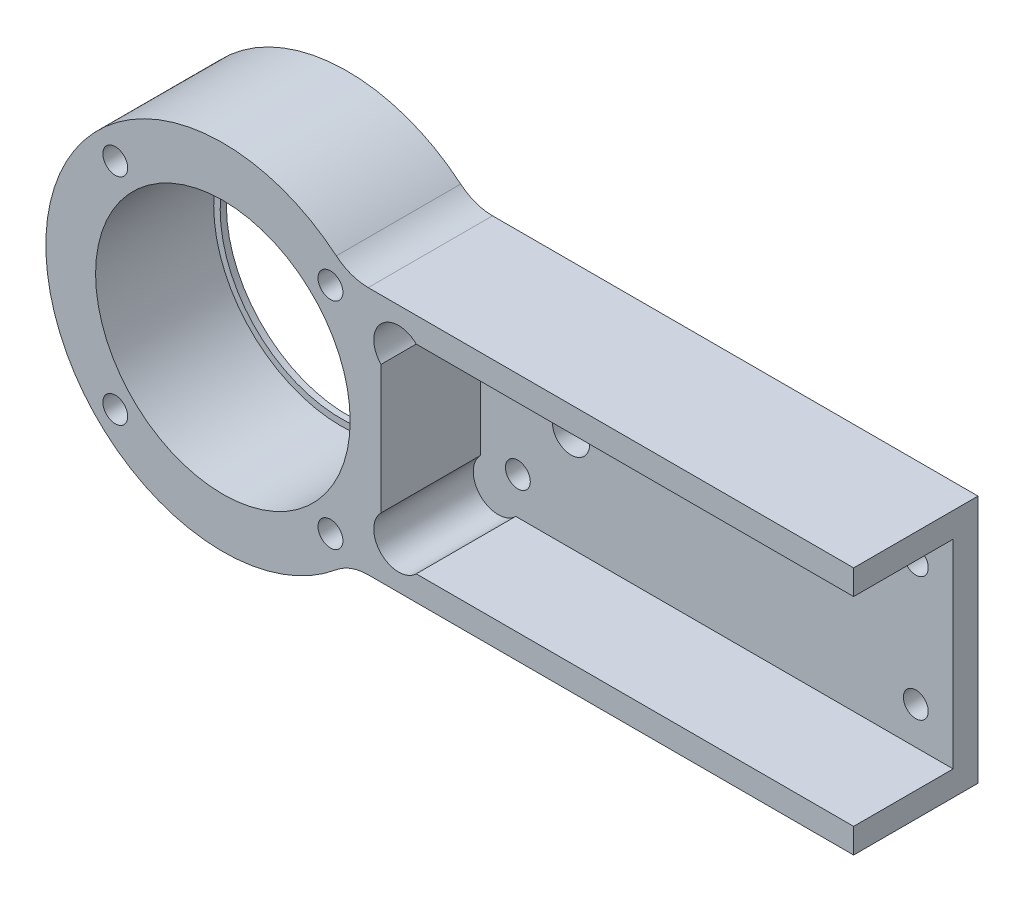
ISO-10303-21;
HEADER;
FILE_DESCRIPTION(('STEP AP214'),'2;1');
FILE_NAME('part.step','',(''),(''),'','','');
FILE_SCHEMA(('AUTOMOTIVE_DESIGN { 1 0 10303 214 1 1 1 1 }'));
ENDSEC;
DATA;
#1=APPLICATION_CONTEXT('core data for automotive mechanical design processes');
#2=APPLICATION_PROTOCOL_DEFINITION('international standard','automotive_design',2000,#1);
#3=PRODUCT_CONTEXT('',#1,'mechanical');
#4=PRODUCT('Part','Part','',(#3));
#5=PRODUCT_RELATED_PRODUCT_CATEGORY('part','',(#4));
#6=PRODUCT_DEFINITION_FORMATION('','',#4);
#7=PRODUCT_DEFINITION_CONTEXT('part definition',#1,'design');
#8=PRODUCT_DEFINITION('design','',#6,#7);
#9=PRODUCT_DEFINITION_SHAPE('','',#8);
#10=(LENGTH_UNIT() NAMED_UNIT(*) SI_UNIT(.MILLI.,.METRE.));
#11=(NAMED_UNIT(*) PLANE_ANGLE_UNIT() SI_UNIT($,.RADIAN.));
#12=(NAMED_UNIT(*) SI_UNIT($,.STERADIAN.) SOLID_ANGLE_UNIT());
#13=UNCERTAINTY_MEASURE_WITH_UNIT(LENGTH_MEASURE(1.E-05),#10,'distance_accuracy_value','');
#14=(GEOMETRIC_REPRESENTATION_CONTEXT(3) GLOBAL_UNCERTAINTY_ASSIGNED_CONTEXT((#13)) GLOBAL_UNIT_ASSIGNED_CONTEXT((#10,
#11,#12)) REPRESENTATION_CONTEXT('',''));
#15=CARTESIAN_POINT('',(0.,0.,0.));
#16=DIRECTION('',(0.,0.,1.));
#17=DIRECTION('',(1.,0.,0.));
#18=AXIS2_PLACEMENT_3D('',#15,#16,#17);
#19=CARTESIAN_POINT('',(0.,0.,6.35));
#20=DIRECTION('',(0.,0.,-1.));
#21=DIRECTION('',(-1.,0.,0.));
#22=AXIS2_PLACEMENT_3D('',#19,#20,#21);
#23=CYLINDRICAL_SURFACE('',#22,32.5);
#24=CARTESIAN_POINT('',(0.,0.,31.75));
#25=DIRECTION('',(0.,0.,1.));
#26=DIRECTION('',(1.,0.,0.));
#27=AXIS2_PLACEMENT_3D('',#24,#25,#26);
#28=CIRCLE('',#27,32.5);
#29=CARTESIAN_POINT('',(32.5,0.,31.75));
#30=VERTEX_POINT('',#29);
#31=EDGE_CURVE('E193',#30,#30,#28,.T.);
#32=ORIENTED_EDGE('',*,*,#31,.T.);
#33=EDGE_LOOP('',(#32));
#34=FACE_BOUND('',#33,.T.);
#35=CARTESIAN_POINT('',(0.,0.,1.5875));
#36=DIRECTION('',(0.,0.,-1.));
#37=DIRECTION('',(-1.,0.,0.));
#38=AXIS2_PLACEMENT_3D('',#35,#36,#37);
#39=CIRCLE('',#38,32.5);
#40=CARTESIAN_POINT('',(-32.5,0.,1.5875));
#41=VERTEX_POINT('',#40);
#42=EDGE_CURVE('E367',#41,#41,#39,.T.);
#43=ORIENTED_EDGE('',*,*,#42,.T.);
#44=EDGE_LOOP('',(#43));
#45=FACE_BOUND('',#44,.T.);
#46=ADVANCED_FACE('F68',(#34,#45),#23,.F.);
#47=CARTESIAN_POINT('',(161.036,7.03881397612349E-13,6.35));
#48=DIRECTION('',(-1.,0.,0.));
#49=DIRECTION('',(0.,-1.,0.));
#50=AXIS2_PLACEMENT_3D('',#47,#48,#49);
#51=PLANE('',#50);
#52=DIRECTION('',(0.,1.,0.));
#53=VECTOR('',#52,1.);
#54=CARTESIAN_POINT('',(161.036,7.03881397612349E-13,0.));
#55=LINE('',#54,#53);
#56=CARTESIAN_POINT('',(161.036,-31.75,0.));
#57=VERTEX_POINT('',#56);
#58=CARTESIAN_POINT('',(161.036,31.75,0.));
#59=VERTEX_POINT('',#58);
#60=EDGE_CURVE('E206',#57,#59,#55,.T.);
#61=ORIENTED_EDGE('',*,*,#60,.T.);
#62=DIRECTION('',(0.,0.,-1.));
#63=VECTOR('',#62,1.);
#64=CARTESIAN_POINT('',(161.036,31.75,6.35));
#65=LINE('',#64,#63);
#66=CARTESIAN_POINT('',(161.036,31.75,31.75));
#67=VERTEX_POINT('',#66);
#68=EDGE_CURVE('E227',#67,#59,#65,.T.);
#69=ORIENTED_EDGE('',*,*,#68,.F.);
#70=DIRECTION('',(0.,1.,0.));
#71=VECTOR('',#70,1.);
#72=CARTESIAN_POINT('',(161.036,-7.03881397612349E-13,31.75));
#73=LINE('',#72,#71);
#74=CARTESIAN_POINT('',(161.036,25.4,31.75));
#75=VERTEX_POINT('',#74);
#76=EDGE_CURVE('E202',#75,#67,#73,.T.);
#77=ORIENTED_EDGE('',*,*,#76,.F.);
#78=DIRECTION('',(0.,0.,-1.));
#79=VECTOR('',#78,1.);
#80=CARTESIAN_POINT('',(161.036,25.4,31.75));
#81=LINE('',#80,#79);
#82=CARTESIAN_POINT('',(161.036,25.4,6.35));
#83=VERTEX_POINT('',#82);
#84=EDGE_CURVE('E197',#75,#83,#81,.T.);
#85=ORIENTED_EDGE('',*,*,#84,.T.);
#86=DIRECTION('',(0.,1.,0.));
#87=VECTOR('',#86,1.);
#88=CARTESIAN_POINT('',(161.036,7.03881397612349E-13,6.35));
#89=LINE('',#88,#87);
#90=CARTESIAN_POINT('',(161.036,-25.4,6.35));
#91=VERTEX_POINT('',#90);
#92=EDGE_CURVE('E207',#91,#83,#89,.T.);
#93=ORIENTED_EDGE('',*,*,#92,.F.);
#94=DIRECTION('',(0.,0.,-1.));
#95=VECTOR('',#94,1.);
#96=CARTESIAN_POINT('',(161.036,-25.4,31.75));
#97=LINE('',#96,#95);
#98=CARTESIAN_POINT('',(161.036,-25.4,31.75));
#99=VERTEX_POINT('',#98);
#100=EDGE_CURVE('E201',#99,#91,#97,.T.);
#101=ORIENTED_EDGE('',*,*,#100,.F.);
#102=DIRECTION('',(0.,-1.,0.));
#103=VECTOR('',#102,1.);
#104=CARTESIAN_POINT('',(161.036,7.03881397612349E-13,31.75));
#105=LINE('',#104,#103);
#106=CARTESIAN_POINT('',(161.036,-31.75,31.75));
#107=VERTEX_POINT('',#106);
#108=EDGE_CURVE('E267',#99,#107,#105,.T.);
#109=ORIENTED_EDGE('',*,*,#108,.T.);
#110=DIRECTION('',(0.,0.,-1.));
#111=VECTOR('',#110,1.);
#112=CARTESIAN_POINT('',(161.036,-31.75,6.35));
#113=LINE('',#112,#111);
#114=EDGE_CURVE('E210',#107,#57,#113,.T.);
#115=ORIENTED_EDGE('',*,*,#114,.T.);
#116=EDGE_LOOP('',(#61,#69,#77,#85,#93,#101,#109,#115));
#117=FACE_BOUND('',#116,.T.);
#118=ADVANCED_FACE('F410',(#117),#51,.F.);
#119=CARTESIAN_POINT('',(0.,31.75,6.35));
#120=DIRECTION('',(0.,1.,0.));
#121=DIRECTION('',(0.,0.,1.));
#122=AXIS2_PLACEMENT_3D('',#119,#120,#121);
#123=PLANE('',#122);
#124=DIRECTION('',(1.,0.,0.));
#125=VECTOR('',#124,1.);
#126=CARTESIAN_POINT('',(0.,31.75,0.));
#127=LINE('',#126,#125);
#128=CARTESIAN_POINT('',(37.102661629592,31.75,0.));
#129=VERTEX_POINT('',#128);
#130=EDGE_CURVE('E215',#129,#59,#127,.T.);
#131=ORIENTED_EDGE('',*,*,#130,.F.);
#132=DIRECTION('',(0.,0.,-1.));
#133=VECTOR('',#132,1.);
#134=CARTESIAN_POINT('',(37.102661629592,31.75,6.35));
#135=LINE('',#134,#133);
#136=CARTESIAN_POINT('',(37.102661629592,31.75,31.75));
#137=VERTEX_POINT('',#136);
#138=EDGE_CURVE('E84',#129,#137,#135,.F.);
#139=ORIENTED_EDGE('',*,*,#138,.T.);
#140=DIRECTION('',(-1.,0.,0.));
#141=VECTOR('',#140,1.);
#142=CARTESIAN_POINT('',(0.,31.75,31.75));
#143=LINE('',#142,#141);
#144=EDGE_CURVE('E190',#67,#137,#143,.T.);
#145=ORIENTED_EDGE('',*,*,#144,.F.);
#146=ORIENTED_EDGE('',*,*,#68,.T.);
#147=EDGE_LOOP('',(#131,#139,#145,#146));
#148=FACE_BOUND('',#147,.T.);
#149=ADVANCED_FACE('F415',(#148),#123,.T.);
#150=CARTESIAN_POINT('',(0.,0.,6.35));
#151=DIRECTION('',(0.,0.,-1.));
#152=DIRECTION('',(-1.,0.,0.));
#153=AXIS2_PLACEMENT_3D('',#150,#151,#152);
#154=CYLINDRICAL_SURFACE('',#153,45.2);
#155=CARTESIAN_POINT('',(0.,0.,0.));
#156=DIRECTION('',(0.,0.,1.));
#157=DIRECTION('',(1.,0.,0.));
#158=AXIS2_PLACEMENT_3D('',#155,#156,#157);
#159=CIRCLE('',#158,45.2);
#160=CARTESIAN_POINT('',(28.9644266952946,34.7001727115717,0.));
#161=VERTEX_POINT('',#160);
#162=CARTESIAN_POINT('',(28.9644266952946,-34.7001727115717,0.));
#163=VERTEX_POINT('',#162);
#164=EDGE_CURVE('E218',#161,#163,#159,.T.);
#165=ORIENTED_EDGE('',*,*,#164,.T.);
#166=DIRECTION('',(0.,0.,-1.));
#167=VECTOR('',#166,1.);
#168=CARTESIAN_POINT('',(28.9644266952946,-34.7001727115717,6.35));
#169=LINE('',#168,#167);
#170=CARTESIAN_POINT('',(28.9644266952946,-34.7001727115717,31.75));
#171=VERTEX_POINT('',#170);
#172=EDGE_CURVE('E244',#163,#171,#169,.F.);
#173=ORIENTED_EDGE('',*,*,#172,.T.);
#174=CARTESIAN_POINT('',(0.,0.,31.75));
#175=DIRECTION('',(0.,0.,1.));
#176=DIRECTION('',(1.,0.,0.));
#177=AXIS2_PLACEMENT_3D('',#174,#175,#176);
#178=CIRCLE('',#177,45.2);
#179=CARTESIAN_POINT('',(28.9644266952946,34.7001727115717,31.75));
#180=VERTEX_POINT('',#179);
#181=EDGE_CURVE('E275',#180,#171,#178,.T.);
#182=ORIENTED_EDGE('',*,*,#181,.F.);
#183=DIRECTION('',(0.,0.,-1.));
#184=VECTOR('',#183,1.);
#185=CARTESIAN_POINT('',(28.9644266952946,34.7001727115717,6.35));
#186=LINE('',#185,#184);
#187=EDGE_CURVE('E240',#180,#161,#186,.T.);
#188=ORIENTED_EDGE('',*,*,#187,.T.);
#189=EDGE_LOOP('',(#165,#173,#182,#188));
#190=FACE_BOUND('',#189,.T.);
#191=ADVANCED_FACE('F422',(#190),#154,.T.);
#192=CARTESIAN_POINT('',(0.,-31.75,6.35));
#193=DIRECTION('',(0.,1.,0.));
#194=DIRECTION('',(0.,0.,1.));
#195=AXIS2_PLACEMENT_3D('',#192,#193,#194);
#196=PLANE('',#195);
#197=DIRECTION('',(-1.,0.,0.));
#198=VECTOR('',#197,1.);
#199=CARTESIAN_POINT('',(0.,-31.75,31.75));
#200=LINE('',#199,#198);
#201=CARTESIAN_POINT('',(37.102661629592,-31.75,31.75));
#202=VERTEX_POINT('',#201);
#203=EDGE_CURVE('E271',#107,#202,#200,.T.);
#204=ORIENTED_EDGE('',*,*,#203,.T.);
#205=DIRECTION('',(0.,0.,1.));
#206=VECTOR('',#205,1.);
#207=CARTESIAN_POINT('',(37.102661629592,-31.75,0.));
#208=LINE('',#207,#206);
#209=CARTESIAN_POINT('',(37.102661629592,-31.75,0.));
#210=VERTEX_POINT('',#209);
#211=EDGE_CURVE('E236',#202,#210,#208,.F.);
#212=ORIENTED_EDGE('',*,*,#211,.T.);
#213=DIRECTION('',(1.,0.,0.));
#214=VECTOR('',#213,1.);
#215=CARTESIAN_POINT('',(0.,-31.75,0.));
#216=LINE('',#215,#214);
#217=EDGE_CURVE('E211',#210,#57,#216,.T.);
#218=ORIENTED_EDGE('',*,*,#217,.T.);
#219=ORIENTED_EDGE('',*,*,#114,.F.);
#220=EDGE_LOOP('',(#204,#212,#218,#219));
#221=FACE_BOUND('',#220,.T.);
#222=ADVANCED_FACE('F403',(#221),#196,.F.);
#223=CARTESIAN_POINT('',(0.,0.,6.35));
#224=DIRECTION('',(0.,0.,1.));
#225=DIRECTION('',(1.,0.,0.));
#226=AXIS2_PLACEMENT_3D('',#223,#224,#225);
#227=PLANE('',#226);
#228=CARTESIAN_POINT('',(63.5,0.,6.35));
#229=DIRECTION('',(0.,0.,-1.));
#230=DIRECTION('',(-1.,0.,0.));
#231=AXIS2_PLACEMENT_3D('',#228,#229,#230);
#232=CIRCLE('',#231,4.7625);
#233=CARTESIAN_POINT('',(58.7375,0.,6.35));
#234=VERTEX_POINT('',#233);
#235=EDGE_CURVE('E359',#234,#234,#232,.T.);
#236=ORIENTED_EDGE('',*,*,#235,.T.);
#237=EDGE_LOOP('',(#236));
#238=FACE_BOUND('',#237,.T.);
#239=CARTESIAN_POINT('',(49.911,15.875,6.35));
#240=DIRECTION('',(0.,0.,1.));
#241=DIRECTION('',(1.,0.,0.));
#242=AXIS2_PLACEMENT_3D('',#239,#240,#241);
#243=CIRCLE('',#242,3.175);
#244=CARTESIAN_POINT('',(53.086,15.875,6.35));
#245=VERTEX_POINT('',#244);
#246=EDGE_CURVE('E287',#245,#245,#243,.T.);
#247=ORIENTED_EDGE('',*,*,#246,.F.);
#248=EDGE_LOOP('',(#247));
#249=FACE_BOUND('',#248,.T.);
#250=DIRECTION('',(0.,1.,0.));
#251=VECTOR('',#250,1.);
#252=CARTESIAN_POINT('',(40.386,0.,6.35));
#253=LINE('',#252,#251);
#254=CARTESIAN_POINT('',(40.386,-16.4197438789308,6.35));
#255=VERTEX_POINT('',#254);
#256=CARTESIAN_POINT('',(40.386,16.4197438789308,6.35));
#257=VERTEX_POINT('',#256);
#258=EDGE_CURVE('E176',#255,#257,#253,.T.);
#259=ORIENTED_EDGE('',*,*,#258,.F.);
#260=CARTESIAN_POINT('',(44.8761280605346,-20.9098719394654,6.35));
#261=DIRECTION('',(0.,0.,1.));
#262=DIRECTION('',(1.,0.,0.));
#263=AXIS2_PLACEMENT_3D('',#260,#261,#262);
#264=CIRCLE('',#263,6.35);
#265=CARTESIAN_POINT('',(49.3662561210691,-25.4,6.35));
#266=VERTEX_POINT('',#265);
#267=EDGE_CURVE('E354',#266,#255,#264,.F.);
#268=ORIENTED_EDGE('',*,*,#267,.F.);
#269=DIRECTION('',(-1.,0.,0.));
#270=VECTOR('',#269,1.);
#271=CARTESIAN_POINT('',(0.,-25.4,6.35));
#272=LINE('',#271,#270);
#273=EDGE_CURVE('E186',#91,#266,#272,.T.);
#274=ORIENTED_EDGE('',*,*,#273,.F.);
#275=ORIENTED_EDGE('',*,*,#92,.T.);
#276=DIRECTION('',(1.,0.,0.));
#277=VECTOR('',#276,1.);
#278=CARTESIAN_POINT('',(0.,25.4,6.35));
#279=LINE('',#278,#277);
#280=CARTESIAN_POINT('',(49.3662561210691,25.4,6.35));
#281=VERTEX_POINT('',#280);
#282=EDGE_CURVE('E178',#281,#83,#279,.T.);
#283=ORIENTED_EDGE('',*,*,#282,.F.);
#284=CARTESIAN_POINT('',(44.8761280605346,20.9098719394654,6.35));
#285=DIRECTION('',(0.,0.,1.));
#286=DIRECTION('',(1.,0.,0.));
#287=AXIS2_PLACEMENT_3D('',#284,#285,#286);
#288=CIRCLE('',#287,6.35);
#289=EDGE_CURVE('E160',#257,#281,#288,.F.);
#290=ORIENTED_EDGE('',*,*,#289,.F.);
#291=EDGE_LOOP('',(#259,#268,#274,#275,#283,#290));
#292=FACE_BOUND('',#291,.T.);
#293=CARTESIAN_POINT('',(49.911,-15.875,6.35));
#294=DIRECTION('',(0.,0.,1.));
#295=DIRECTION('',(1.,0.,0.));
#296=AXIS2_PLACEMENT_3D('',#293,#294,#295);
#297=CIRCLE('',#296,3.175);
#298=CARTESIAN_POINT('',(53.086,-15.875,6.35));
#299=VERTEX_POINT('',#298);
#300=EDGE_CURVE('E299',#299,#299,#297,.T.);
#301=ORIENTED_EDGE('',*,*,#300,.F.);
#302=EDGE_LOOP('',(#301));
#303=FACE_BOUND('',#302,.T.);
#304=CARTESIAN_POINT('',(151.511,15.875,6.35));
#305=DIRECTION('',(0.,0.,1.));
#306=DIRECTION('',(1.,0.,0.));
#307=AXIS2_PLACEMENT_3D('',#304,#305,#306);
#308=CIRCLE('',#307,3.175);
#309=CARTESIAN_POINT('',(154.686,15.875,6.35));
#310=VERTEX_POINT('',#309);
#311=EDGE_CURVE('E291',#310,#310,#308,.T.);
#312=ORIENTED_EDGE('',*,*,#311,.F.);
#313=EDGE_LOOP('',(#312));
#314=FACE_BOUND('',#313,.T.);
#315=CARTESIAN_POINT('',(151.511,-15.875,6.35));
#316=DIRECTION('',(0.,0.,1.));
#317=DIRECTION('',(1.,0.,0.));
#318=AXIS2_PLACEMENT_3D('',#315,#316,#317);
#319=CIRCLE('',#318,3.175);
#320=CARTESIAN_POINT('',(154.686,-15.875,6.35));
#321=VERTEX_POINT('',#320);
#322=EDGE_CURVE('E295',#321,#321,#319,.T.);
#323=ORIENTED_EDGE('',*,*,#322,.F.);
#324=EDGE_LOOP('',(#323));
#325=FACE_BOUND('',#324,.T.);
#326=ADVANCED_FACE('F173',(#238,#249,#292,#303,#314,#325),#227,.T.);
#327=CARTESIAN_POINT('',(0.,0.,0.));
#328=DIRECTION('',(0.,0.,1.));
#329=DIRECTION('',(1.,0.,0.));
#330=AXIS2_PLACEMENT_3D('',#327,#328,#329);
#331=PLANE('',#330);
#332=CARTESIAN_POINT('',(63.5,0.,0.));
#333=DIRECTION('',(0.,0.,-1.));
#334=DIRECTION('',(-1.,0.,0.));
#335=AXIS2_PLACEMENT_3D('',#332,#333,#334);
#336=CIRCLE('',#335,4.7625);
#337=CARTESIAN_POINT('',(58.7375,0.,0.));
#338=VERTEX_POINT('',#337);
#339=EDGE_CURVE('E363',#338,#338,#336,.T.);
#340=ORIENTED_EDGE('',*,*,#339,.F.);
#341=EDGE_LOOP('',(#340));
#342=FACE_BOUND('',#341,.T.);
#343=CARTESIAN_POINT('',(-27.4710984490973,-27.4710984490974,0.));
#344=DIRECTION('',(0.,0.,1.));
#345=DIRECTION('',(1.,0.,0.));
#346=AXIS2_PLACEMENT_3D('',#343,#344,#345);
#347=CIRCLE('',#346,3.175);
#348=CARTESIAN_POINT('',(-24.2960984490973,-27.4710984490974,0.));
#349=VERTEX_POINT('',#348);
#350=EDGE_CURVE('E311',#349,#349,#347,.T.);
#351=ORIENTED_EDGE('',*,*,#350,.T.);
#352=EDGE_LOOP('',(#351));
#353=FACE_BOUND('',#352,.T.);
#354=CARTESIAN_POINT('',(49.911,15.875,0.));
#355=DIRECTION('',(0.,0.,1.));
#356=DIRECTION('',(1.,0.,0.));
#357=AXIS2_PLACEMENT_3D('',#354,#355,#356);
#358=CIRCLE('',#357,3.175);
#359=CARTESIAN_POINT('',(53.086,15.875,0.));
#360=VERTEX_POINT('',#359);
#361=EDGE_CURVE('E321',#360,#360,#358,.T.);
#362=ORIENTED_EDGE('',*,*,#361,.T.);
#363=EDGE_LOOP('',(#362));
#364=FACE_BOUND('',#363,.T.);
#365=CARTESIAN_POINT('',(151.511,15.875,0.));
#366=DIRECTION('',(0.,0.,1.));
#367=DIRECTION('',(1.,0.,0.));
#368=AXIS2_PLACEMENT_3D('',#365,#366,#367);
#369=CIRCLE('',#368,3.175);
#370=CARTESIAN_POINT('',(154.686,15.875,0.));
#371=VERTEX_POINT('',#370);
#372=EDGE_CURVE('E316',#371,#371,#369,.T.);
#373=ORIENTED_EDGE('',*,*,#372,.T.);
#374=EDGE_LOOP('',(#373));
#375=FACE_BOUND('',#374,.T.);
#376=CARTESIAN_POINT('',(151.511,-15.875,0.));
#377=DIRECTION('',(0.,0.,1.));
#378=DIRECTION('',(1.,0.,0.));
#379=AXIS2_PLACEMENT_3D('',#376,#377,#378);
#380=CIRCLE('',#379,3.175);
#381=CARTESIAN_POINT('',(154.686,-15.875,0.));
#382=VERTEX_POINT('',#381);
#383=EDGE_CURVE('E312',#382,#382,#380,.T.);
#384=ORIENTED_EDGE('',*,*,#383,.T.);
#385=EDGE_LOOP('',(#384));
#386=FACE_BOUND('',#385,.T.);
#387=CARTESIAN_POINT('',(49.911,-15.875,0.));
#388=DIRECTION('',(0.,0.,1.));
#389=DIRECTION('',(1.,0.,0.));
#390=AXIS2_PLACEMENT_3D('',#387,#388,#389);
#391=CIRCLE('',#390,3.175);
#392=CARTESIAN_POINT('',(53.086,-15.875,0.));
#393=VERTEX_POINT('',#392);
#394=EDGE_CURVE('E317',#393,#393,#391,.T.);
#395=ORIENTED_EDGE('',*,*,#394,.T.);
#396=EDGE_LOOP('',(#395));
#397=FACE_BOUND('',#396,.T.);
#398=CARTESIAN_POINT('',(27.4710984490973,27.4710984490974,0.));
#399=DIRECTION('',(0.,0.,1.));
#400=DIRECTION('',(1.,0.,0.));
#401=AXIS2_PLACEMENT_3D('',#398,#399,#400);
#402=CIRCLE('',#401,3.175);
#403=CARTESIAN_POINT('',(30.6460984490973,27.4710984490974,0.));
#404=VERTEX_POINT('',#403);
#405=EDGE_CURVE('E341',#404,#404,#402,.T.);
#406=ORIENTED_EDGE('',*,*,#405,.T.);
#407=EDGE_LOOP('',(#406));
#408=FACE_BOUND('',#407,.T.);
#409=CARTESIAN_POINT('',(-27.4710984490975,27.4710984490972,0.));
#410=DIRECTION('',(0.,0.,1.));
#411=DIRECTION('',(1.,0.,0.));
#412=AXIS2_PLACEMENT_3D('',#409,#410,#411);
#413=CIRCLE('',#412,3.175);
#414=CARTESIAN_POINT('',(-24.2960984490975,27.4710984490972,0.));
#415=VERTEX_POINT('',#414);
#416=EDGE_CURVE('E332',#415,#415,#413,.T.);
#417=ORIENTED_EDGE('',*,*,#416,.T.);
#418=EDGE_LOOP('',(#417));
#419=FACE_BOUND('',#418,.T.);
#420=CARTESIAN_POINT('',(27.4710984490975,-27.4710984490972,0.));
#421=DIRECTION('',(0.,0.,1.));
#422=DIRECTION('',(1.,0.,0.));
#423=AXIS2_PLACEMENT_3D('',#420,#421,#422);
#424=CIRCLE('',#423,3.17500000000001);
#425=CARTESIAN_POINT('',(30.6460984490975,-27.4710984490972,0.));
#426=VERTEX_POINT('',#425);
#427=EDGE_CURVE('E303',#426,#426,#424,.T.);
#428=ORIENTED_EDGE('',*,*,#427,.T.);
#429=EDGE_LOOP('',(#428));
#430=FACE_BOUND('',#429,.T.);
#431=ORIENTED_EDGE('',*,*,#60,.F.);
#432=ORIENTED_EDGE('',*,*,#217,.F.);
#433=CARTESIAN_POINT('',(37.102661629592,-44.45,0.));
#434=DIRECTION('',(0.,0.,1.));
#435=DIRECTION('',(1.,0.,0.));
#436=AXIS2_PLACEMENT_3D('',#433,#434,#435);
#437=CIRCLE('',#436,12.7);
#438=EDGE_CURVE('E249',#210,#163,#437,.T.);
#439=ORIENTED_EDGE('',*,*,#438,.T.);
#440=ORIENTED_EDGE('',*,*,#164,.F.);
#441=CARTESIAN_POINT('',(37.102661629592,44.45,0.));
#442=DIRECTION('',(0.,0.,1.));
#443=DIRECTION('',(1.,0.,0.));
#444=AXIS2_PLACEMENT_3D('',#441,#442,#443);
#445=CIRCLE('',#444,12.7);
#446=EDGE_CURVE('E77',#161,#129,#445,.T.);
#447=ORIENTED_EDGE('',*,*,#446,.T.);
#448=ORIENTED_EDGE('',*,*,#130,.T.);
#449=EDGE_LOOP('',(#431,#432,#439,#440,#447,#448));
#450=FACE_BOUND('',#449,.T.);
#451=CARTESIAN_POINT('',(0.,0.,0.));
#452=DIRECTION('',(0.,0.,-1.));
#453=DIRECTION('',(-1.,0.,0.));
#454=AXIS2_PLACEMENT_3D('',#451,#452,#453);
#455=CIRCLE('',#454,30.849);
#456=CARTESIAN_POINT('',(-30.849,0.,0.));
#457=VERTEX_POINT('',#456);
#458=EDGE_CURVE('E375',#457,#457,#455,.T.);
#459=ORIENTED_EDGE('',*,*,#458,.F.);
#460=EDGE_LOOP('',(#459));
#461=FACE_BOUND('',#460,.T.);
#462=ADVANCED_FACE('F392',(#342,#353,#364,#375,#386,#397,#408,#419,#430,#450,#461),#331,.F.);
#463=CARTESIAN_POINT('',(0.,0.,31.75));
#464=DIRECTION('',(0.,0.,1.));
#465=DIRECTION('',(1.,0.,0.));
#466=AXIS2_PLACEMENT_3D('',#463,#464,#465);
#467=PLANE('',#466);
#468=CARTESIAN_POINT('',(44.8761280605346,20.9098719394654,31.75));
#469=DIRECTION('',(0.,0.,1.));
#470=DIRECTION('',(1.,0.,0.));
#471=AXIS2_PLACEMENT_3D('',#468,#469,#470);
#472=CIRCLE('',#471,6.35);
#473=CARTESIAN_POINT('',(49.3662561210691,25.4,31.75));
#474=VERTEX_POINT('',#473);
#475=CARTESIAN_POINT('',(40.386,16.4197438789308,31.75));
#476=VERTEX_POINT('',#475);
#477=EDGE_CURVE('E162',#474,#476,#472,.T.);
#478=ORIENTED_EDGE('',*,*,#477,.F.);
#479=DIRECTION('',(1.,0.,0.));
#480=VECTOR('',#479,1.);
#481=CARTESIAN_POINT('',(0.,25.4,31.75));
#482=LINE('',#481,#480);
#483=EDGE_CURVE('E258',#474,#75,#482,.T.);
#484=ORIENTED_EDGE('',*,*,#483,.T.);
#485=ORIENTED_EDGE('',*,*,#76,.T.);
#486=ORIENTED_EDGE('',*,*,#144,.T.);
#487=CARTESIAN_POINT('',(37.102661629592,44.45,31.75));
#488=DIRECTION('',(0.,0.,1.));
#489=DIRECTION('',(1.,0.,0.));
#490=AXIS2_PLACEMENT_3D('',#487,#488,#489);
#491=CIRCLE('',#490,12.7);
#492=EDGE_CURVE('E12',#137,#180,#491,.F.);
#493=ORIENTED_EDGE('',*,*,#492,.T.);
#494=ORIENTED_EDGE('',*,*,#181,.T.);
#495=CARTESIAN_POINT('',(37.102661629592,-44.45,31.75));
#496=DIRECTION('',(0.,0.,1.));
#497=DIRECTION('',(1.,0.,0.));
#498=AXIS2_PLACEMENT_3D('',#495,#496,#497);
#499=CIRCLE('',#498,12.7);
#500=EDGE_CURVE('E252',#171,#202,#499,.F.);
#501=ORIENTED_EDGE('',*,*,#500,.T.);
#502=ORIENTED_EDGE('',*,*,#203,.F.);
#503=ORIENTED_EDGE('',*,*,#108,.F.);
#504=DIRECTION('',(-1.,0.,0.));
#505=VECTOR('',#504,1.);
#506=CARTESIAN_POINT('',(0.,-25.4,31.75));
#507=LINE('',#506,#505);
#508=CARTESIAN_POINT('',(49.3662561210691,-25.4,31.75));
#509=VERTEX_POINT('',#508);
#510=EDGE_CURVE('E263',#99,#509,#507,.T.);
#511=ORIENTED_EDGE('',*,*,#510,.T.);
#512=CARTESIAN_POINT('',(44.8761280605346,-20.9098719394654,31.75));
#513=DIRECTION('',(0.,0.,1.));
#514=DIRECTION('',(-1.,0.,0.));
#515=AXIS2_PLACEMENT_3D('',#512,#513,#514);
#516=CIRCLE('',#515,6.35);
#517=CARTESIAN_POINT('',(40.386,-16.4197438789308,31.75));
#518=VERTEX_POINT('',#517);
#519=EDGE_CURVE('E357',#518,#509,#516,.T.);
#520=ORIENTED_EDGE('',*,*,#519,.F.);
#521=DIRECTION('',(0.,1.,0.));
#522=VECTOR('',#521,1.);
#523=CARTESIAN_POINT('',(40.386,0.,31.75));
#524=LINE('',#523,#522);
#525=EDGE_CURVE('E260',#518,#476,#524,.T.);
#526=ORIENTED_EDGE('',*,*,#525,.T.);
#527=EDGE_LOOP('',(#478,#484,#485,#486,#493,#494,#501,#502,#503,#511,#520,#526));
#528=FACE_BOUND('',#527,.T.);
#529=CARTESIAN_POINT('',(-27.4710984490973,-27.4710984490974,31.75));
#530=DIRECTION('',(0.,0.,1.));
#531=DIRECTION('',(1.,0.,0.));
#532=AXIS2_PLACEMENT_3D('',#529,#530,#531);
#533=CIRCLE('',#532,3.175);
#534=CARTESIAN_POINT('',(-24.2960984490973,-27.4710984490974,31.75));
#535=VERTEX_POINT('',#534);
#536=EDGE_CURVE('E325',#535,#535,#533,.T.);
#537=ORIENTED_EDGE('',*,*,#536,.F.);
#538=EDGE_LOOP('',(#537));
#539=FACE_BOUND('',#538,.T.);
#540=CARTESIAN_POINT('',(27.4710984490973,27.4710984490974,31.75));
#541=DIRECTION('',(0.,0.,1.));
#542=DIRECTION('',(1.,0.,0.));
#543=AXIS2_PLACEMENT_3D('',#540,#541,#542);
#544=CIRCLE('',#543,3.175);
#545=CARTESIAN_POINT('',(30.6460984490973,27.4710984490974,31.75));
#546=VERTEX_POINT('',#545);
#547=EDGE_CURVE('E336',#546,#546,#544,.T.);
#548=ORIENTED_EDGE('',*,*,#547,.F.);
#549=EDGE_LOOP('',(#548));
#550=FACE_BOUND('',#549,.T.);
#551=CARTESIAN_POINT('',(-27.4710984490975,27.4710984490972,31.75));
#552=DIRECTION('',(0.,0.,1.));
#553=DIRECTION('',(1.,0.,0.));
#554=AXIS2_PLACEMENT_3D('',#551,#552,#553);
#555=CIRCLE('',#554,3.175);
#556=CARTESIAN_POINT('',(-24.2960984490975,27.4710984490972,31.75));
#557=VERTEX_POINT('',#556);
#558=EDGE_CURVE('E337',#557,#557,#555,.T.);
#559=ORIENTED_EDGE('',*,*,#558,.F.);
#560=EDGE_LOOP('',(#559));
#561=FACE_BOUND('',#560,.T.);
#562=CARTESIAN_POINT('',(27.4710984490975,-27.4710984490972,31.75));
#563=DIRECTION('',(0.,0.,1.));
#564=DIRECTION('',(1.,0.,0.));
#565=AXIS2_PLACEMENT_3D('',#562,#563,#564);
#566=CIRCLE('',#565,3.17500000000001);
#567=CARTESIAN_POINT('',(30.6460984490975,-27.4710984490972,31.75));
#568=VERTEX_POINT('',#567);
#569=EDGE_CURVE('E307',#568,#568,#566,.T.);
#570=ORIENTED_EDGE('',*,*,#569,.F.);
#571=EDGE_LOOP('',(#570));
#572=FACE_BOUND('',#571,.T.);
#573=ORIENTED_EDGE('',*,*,#31,.F.);
#574=EDGE_LOOP('',(#573));
#575=FACE_BOUND('',#574,.T.);
#576=ADVANCED_FACE('F394',(#528,#539,#550,#561,#572,#575),#467,.T.);
#577=CARTESIAN_POINT('',(0.,-25.4,31.75));
#578=DIRECTION('',(0.,-1.,0.));
#579=DIRECTION('',(0.,0.,-1.));
#580=AXIS2_PLACEMENT_3D('',#577,#578,#579);
#581=PLANE('',#580);
#582=ORIENTED_EDGE('',*,*,#273,.T.);
#583=DIRECTION('',(0.,0.,1.));
#584=VECTOR('',#583,1.);
#585=CARTESIAN_POINT('',(49.3662561210691,-25.4,-11.6105122421383));
#586=LINE('',#585,#584);
#587=EDGE_CURVE('E168',#266,#509,#586,.T.);
#588=ORIENTED_EDGE('',*,*,#587,.T.);
#589=ORIENTED_EDGE('',*,*,#510,.F.);
#590=ORIENTED_EDGE('',*,*,#100,.T.);
#591=EDGE_LOOP('',(#582,#588,#589,#590));
#592=FACE_BOUND('',#591,.T.);
#593=ADVANCED_FACE('F401',(#592),#581,.F.);
#594=CARTESIAN_POINT('',(40.386,0.,31.75));
#595=DIRECTION('',(-1.,0.,0.));
#596=DIRECTION('',(0.,0.,1.));
#597=AXIS2_PLACEMENT_3D('',#594,#595,#596);
#598=PLANE('',#597);
#599=ORIENTED_EDGE('',*,*,#258,.T.);
#600=DIRECTION('',(0.,0.,1.));
#601=VECTOR('',#600,1.);
#602=CARTESIAN_POINT('',(40.386,16.4197438789308,-11.6105122421383));
#603=LINE('',#602,#601);
#604=EDGE_CURVE('E156',#257,#476,#603,.T.);
#605=ORIENTED_EDGE('',*,*,#604,.T.);
#606=ORIENTED_EDGE('',*,*,#525,.F.);
#607=DIRECTION('',(0.,0.,1.));
#608=VECTOR('',#607,1.);
#609=CARTESIAN_POINT('',(40.386,-16.4197438789308,-11.6105122421383));
#610=LINE('',#609,#608);
#611=EDGE_CURVE('E184',#518,#255,#610,.F.);
#612=ORIENTED_EDGE('',*,*,#611,.T.);
#613=EDGE_LOOP('',(#599,#605,#606,#612));
#614=FACE_BOUND('',#613,.T.);
#615=ADVANCED_FACE('F182',(#614),#598,.F.);
#616=CARTESIAN_POINT('',(0.,25.4,31.75));
#617=DIRECTION('',(0.,1.,0.));
#618=DIRECTION('',(0.,0.,1.));
#619=AXIS2_PLACEMENT_3D('',#616,#617,#618);
#620=PLANE('',#619);
#621=ORIENTED_EDGE('',*,*,#483,.F.);
#622=DIRECTION('',(0.,0.,1.));
#623=VECTOR('',#622,1.);
#624=CARTESIAN_POINT('',(49.3662561210691,25.4,-11.6105122421383));
#625=LINE('',#624,#623);
#626=EDGE_CURVE('E231',#474,#281,#625,.F.);
#627=ORIENTED_EDGE('',*,*,#626,.T.);
#628=ORIENTED_EDGE('',*,*,#282,.T.);
#629=ORIENTED_EDGE('',*,*,#84,.F.);
#630=EDGE_LOOP('',(#621,#627,#628,#629));
#631=FACE_BOUND('',#630,.T.);
#632=ADVANCED_FACE('F453',(#631),#620,.F.);
#633=CARTESIAN_POINT('',(27.4710984490975,-27.4710984490972,0.));
#634=DIRECTION('',(0.,0.,1.));
#635=DIRECTION('',(1.,0.,0.));
#636=AXIS2_PLACEMENT_3D('',#633,#634,#635);
#637=CYLINDRICAL_SURFACE('',#636,3.17500000000001);
#638=ORIENTED_EDGE('',*,*,#427,.F.);
#639=EDGE_LOOP('',(#638));
#640=FACE_BOUND('',#639,.T.);
#641=ORIENTED_EDGE('',*,*,#569,.T.);
#642=EDGE_LOOP('',(#641));
#643=FACE_BOUND('',#642,.T.);
#644=ADVANCED_FACE('F479',(#640,#643),#637,.F.);
#645=CARTESIAN_POINT('',(-27.4710984490975,27.4710984490972,0.));
#646=DIRECTION('',(0.,0.,1.));
#647=DIRECTION('',(1.,0.,0.));
#648=AXIS2_PLACEMENT_3D('',#645,#646,#647);
#649=CYLINDRICAL_SURFACE('',#648,3.175);
#650=ORIENTED_EDGE('',*,*,#416,.F.);
#651=EDGE_LOOP('',(#650));
#652=FACE_BOUND('',#651,.T.);
#653=ORIENTED_EDGE('',*,*,#558,.T.);
#654=EDGE_LOOP('',(#653));
#655=FACE_BOUND('',#654,.T.);
#656=ADVANCED_FACE('F475',(#652,#655),#649,.F.);
#657=CARTESIAN_POINT('',(27.4710984490973,27.4710984490974,0.));
#658=DIRECTION('',(0.,0.,1.));
#659=DIRECTION('',(1.,0.,0.));
#660=AXIS2_PLACEMENT_3D('',#657,#658,#659);
#661=CYLINDRICAL_SURFACE('',#660,3.175);
#662=ORIENTED_EDGE('',*,*,#405,.F.);
#663=EDGE_LOOP('',(#662));
#664=FACE_BOUND('',#663,.T.);
#665=ORIENTED_EDGE('',*,*,#547,.T.);
#666=EDGE_LOOP('',(#665));
#667=FACE_BOUND('',#666,.T.);
#668=ADVANCED_FACE('F472',(#664,#667),#661,.F.);
#669=CARTESIAN_POINT('',(-27.4710984490973,-27.4710984490974,0.));
#670=DIRECTION('',(0.,0.,1.));
#671=DIRECTION('',(1.,0.,0.));
#672=AXIS2_PLACEMENT_3D('',#669,#670,#671);
#673=CYLINDRICAL_SURFACE('',#672,3.175);
#674=ORIENTED_EDGE('',*,*,#350,.F.);
#675=EDGE_LOOP('',(#674));
#676=FACE_BOUND('',#675,.T.);
#677=ORIENTED_EDGE('',*,*,#536,.T.);
#678=EDGE_LOOP('',(#677));
#679=FACE_BOUND('',#678,.T.);
#680=ADVANCED_FACE('F470',(#676,#679),#673,.F.);
#681=CARTESIAN_POINT('',(49.911,-15.875,0.));
#682=DIRECTION('',(0.,0.,1.));
#683=DIRECTION('',(1.,0.,0.));
#684=AXIS2_PLACEMENT_3D('',#681,#682,#683);
#685=CYLINDRICAL_SURFACE('',#684,3.175);
#686=ORIENTED_EDGE('',*,*,#300,.T.);
#687=EDGE_LOOP('',(#686));
#688=FACE_BOUND('',#687,.T.);
#689=ORIENTED_EDGE('',*,*,#394,.F.);
#690=EDGE_LOOP('',(#689));
#691=FACE_BOUND('',#690,.T.);
#692=ADVANCED_FACE('F466',(#688,#691),#685,.F.);
#693=CARTESIAN_POINT('',(151.511,-15.875,0.));
#694=DIRECTION('',(0.,0.,1.));
#695=DIRECTION('',(1.,0.,0.));
#696=AXIS2_PLACEMENT_3D('',#693,#694,#695);
#697=CYLINDRICAL_SURFACE('',#696,3.175);
#698=ORIENTED_EDGE('',*,*,#322,.T.);
#699=EDGE_LOOP('',(#698));
#700=FACE_BOUND('',#699,.T.);
#701=ORIENTED_EDGE('',*,*,#383,.F.);
#702=EDGE_LOOP('',(#701));
#703=FACE_BOUND('',#702,.T.);
#704=ADVANCED_FACE('F469',(#700,#703),#697,.F.);
#705=CARTESIAN_POINT('',(151.511,15.875,0.));
#706=DIRECTION('',(0.,0.,1.));
#707=DIRECTION('',(1.,0.,0.));
#708=AXIS2_PLACEMENT_3D('',#705,#706,#707);
#709=CYLINDRICAL_SURFACE('',#708,3.175);
#710=ORIENTED_EDGE('',*,*,#311,.T.);
#711=EDGE_LOOP('',(#710));
#712=FACE_BOUND('',#711,.T.);
#713=ORIENTED_EDGE('',*,*,#372,.F.);
#714=EDGE_LOOP('',(#713));
#715=FACE_BOUND('',#714,.T.);
#716=ADVANCED_FACE('F486',(#712,#715),#709,.F.);
#717=CARTESIAN_POINT('',(49.911,15.875,0.));
#718=DIRECTION('',(0.,0.,1.));
#719=DIRECTION('',(1.,0.,0.));
#720=AXIS2_PLACEMENT_3D('',#717,#718,#719);
#721=CYLINDRICAL_SURFACE('',#720,3.175);
#722=ORIENTED_EDGE('',*,*,#246,.T.);
#723=EDGE_LOOP('',(#722));
#724=FACE_BOUND('',#723,.T.);
#725=ORIENTED_EDGE('',*,*,#361,.F.);
#726=EDGE_LOOP('',(#725));
#727=FACE_BOUND('',#726,.T.);
#728=ADVANCED_FACE('F463',(#724,#727),#721,.F.);
#729=CARTESIAN_POINT('',(44.8761280605346,20.9098719394654,-11.6105122421383));
#730=DIRECTION('',(0.,0.,1.));
#731=DIRECTION('',(1.,0.,0.));
#732=AXIS2_PLACEMENT_3D('',#729,#730,#731);
#733=CYLINDRICAL_SURFACE('',#732,6.35);
#734=ORIENTED_EDGE('',*,*,#289,.T.);
#735=ORIENTED_EDGE('',*,*,#626,.F.);
#736=ORIENTED_EDGE('',*,*,#477,.T.);
#737=ORIENTED_EDGE('',*,*,#604,.F.);
#738=EDGE_LOOP('',(#734,#735,#736,#737));
#739=FACE_BOUND('',#738,.T.);
#740=ADVANCED_FACE('F158',(#739),#733,.F.);
#741=CARTESIAN_POINT('',(44.8761280605346,-20.9098719394654,-11.6105122421383));
#742=DIRECTION('',(0.,0.,1.));
#743=DIRECTION('',(1.,0.,0.));
#744=AXIS2_PLACEMENT_3D('',#741,#742,#743);
#745=CYLINDRICAL_SURFACE('',#744,6.35);
#746=ORIENTED_EDGE('',*,*,#267,.T.);
#747=ORIENTED_EDGE('',*,*,#611,.F.);
#748=ORIENTED_EDGE('',*,*,#519,.T.);
#749=ORIENTED_EDGE('',*,*,#587,.F.);
#750=EDGE_LOOP('',(#746,#747,#748,#749));
#751=FACE_BOUND('',#750,.T.);
#752=ADVANCED_FACE('F437',(#751),#745,.F.);
#753=CARTESIAN_POINT('',(63.5,0.,6.35));
#754=DIRECTION('',(0.,0.,-1.));
#755=DIRECTION('',(-1.,0.,0.));
#756=AXIS2_PLACEMENT_3D('',#753,#754,#755);
#757=CYLINDRICAL_SURFACE('',#756,4.7625);
#758=ORIENTED_EDGE('',*,*,#235,.F.);
#759=EDGE_LOOP('',(#758));
#760=FACE_BOUND('',#759,.T.);
#761=ORIENTED_EDGE('',*,*,#339,.T.);
#762=EDGE_LOOP('',(#761));
#763=FACE_BOUND('',#762,.T.);
#764=ADVANCED_FACE('F430',(#760,#763),#757,.F.);
#765=CARTESIAN_POINT('',(37.102661629592,-44.45,6.35));
#766=DIRECTION('',(0.,0.,-1.));
#767=DIRECTION('',(-1.,0.,0.));
#768=AXIS2_PLACEMENT_3D('',#765,#766,#767);
#769=CYLINDRICAL_SURFACE('',#768,12.7);
#770=ORIENTED_EDGE('',*,*,#500,.F.);
#771=ORIENTED_EDGE('',*,*,#172,.F.);
#772=ORIENTED_EDGE('',*,*,#438,.F.);
#773=ORIENTED_EDGE('',*,*,#211,.F.);
#774=EDGE_LOOP('',(#770,#771,#772,#773));
#775=FACE_BOUND('',#774,.T.);
#776=ADVANCED_FACE('F428',(#775),#769,.F.);
#777=CARTESIAN_POINT('',(37.102661629592,44.45,6.35));
#778=DIRECTION('',(0.,0.,-1.));
#779=DIRECTION('',(-1.,0.,0.));
#780=AXIS2_PLACEMENT_3D('',#777,#778,#779);
#781=CYLINDRICAL_SURFACE('',#780,12.7);
#782=ORIENTED_EDGE('',*,*,#492,.F.);
#783=ORIENTED_EDGE('',*,*,#138,.F.);
#784=ORIENTED_EDGE('',*,*,#446,.F.);
#785=ORIENTED_EDGE('',*,*,#187,.F.);
#786=EDGE_LOOP('',(#782,#783,#784,#785));
#787=FACE_BOUND('',#786,.T.);
#788=ADVANCED_FACE('F70',(#787),#781,.F.);
#789=CARTESIAN_POINT('',(0.,0.,1.5875));
#790=DIRECTION('',(0.,0.,-1.));
#791=DIRECTION('',(-1.,0.,0.));
#792=AXIS2_PLACEMENT_3D('',#789,#790,#791);
#793=PLANE('',#792);
#794=CARTESIAN_POINT('',(0.,0.,1.5875));
#795=DIRECTION('',(0.,0.,-1.));
#796=DIRECTION('',(-1.,0.,0.));
#797=AXIS2_PLACEMENT_3D('',#794,#795,#796);
#798=CIRCLE('',#797,30.849);
#799=CARTESIAN_POINT('',(-30.849,0.,1.5875));
#800=VERTEX_POINT('',#799);
#801=EDGE_CURVE('E374',#800,#800,#798,.T.);
#802=ORIENTED_EDGE('',*,*,#801,.T.);
#803=EDGE_LOOP('',(#802));
#804=FACE_BOUND('',#803,.T.);
#805=ORIENTED_EDGE('',*,*,#42,.F.);
#806=EDGE_LOOP('',(#805));
#807=FACE_BOUND('',#806,.T.);
#808=ADVANCED_FACE('F383',(#804,#807),#793,.F.);
#809=CARTESIAN_POINT('',(0.,0.,1.5875));
#810=DIRECTION('',(0.,0.,-1.));
#811=DIRECTION('',(-1.,0.,0.));
#812=AXIS2_PLACEMENT_3D('',#809,#810,#811);
#813=CYLINDRICAL_SURFACE('',#812,30.849);
#814=ORIENTED_EDGE('',*,*,#801,.F.);
#815=EDGE_LOOP('',(#814));
#816=FACE_BOUND('',#815,.T.);
#817=ORIENTED_EDGE('',*,*,#458,.T.);
#818=EDGE_LOOP('',(#817));
#819=FACE_BOUND('',#818,.T.);
#820=ADVANCED_FACE('F386',(#816,#819),#813,.F.);
#821=CLOSED_SHELL('',(#46,#118,#149,#191,#222,#326,#462,#576,#593,#615,#632,#644,#656,#668,#680,
#692,#704,#716,#728,#740,#752,#764,#776,#788,#808,#820));
#822=MANIFOLD_SOLID_BREP('B2',#821);
#823=ADVANCED_BREP_SHAPE_REPRESENTATION('',(#18,#822),#14);
#824=SHAPE_DEFINITION_REPRESENTATION(#9,#823);
ENDSEC;
END-ISO-10303-21;
